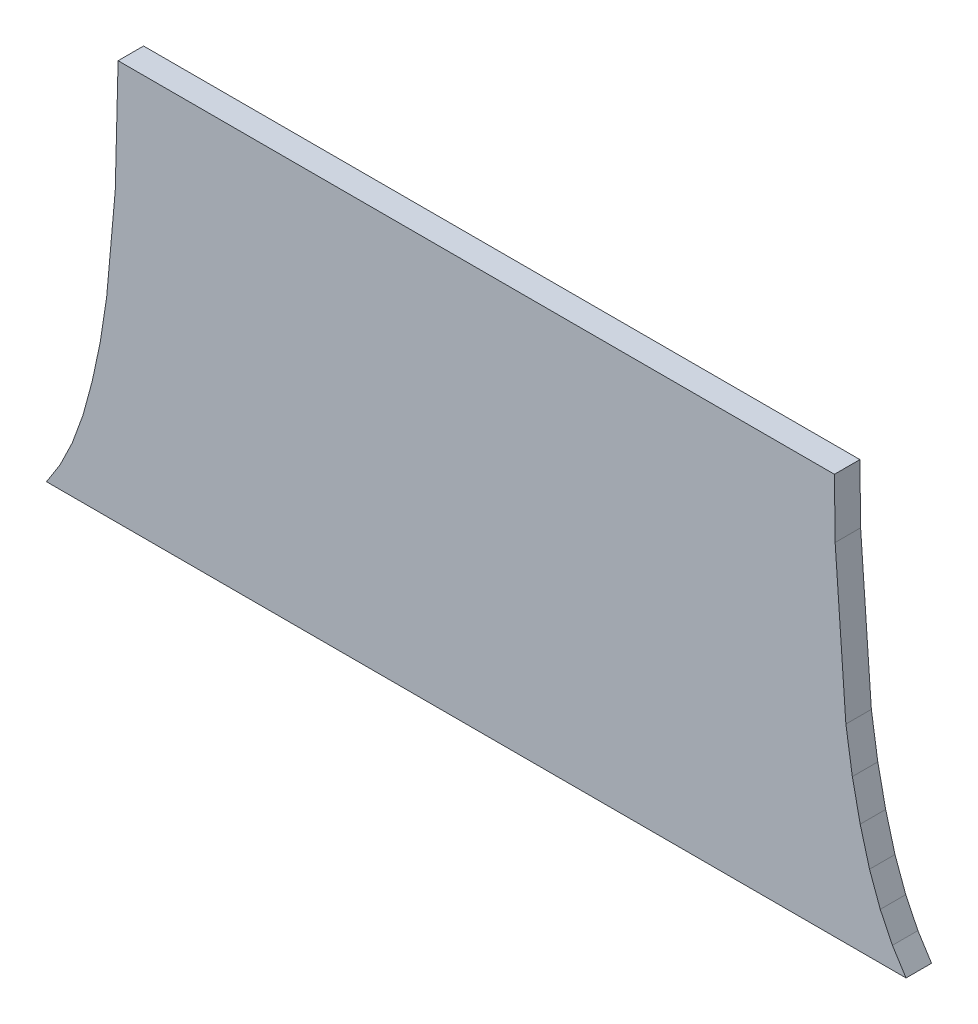
ISO-10303-21;
HEADER;
FILE_DESCRIPTION(('STEP AP214'),'2;1');
FILE_NAME('part.step','',(''),(''),'','','');
FILE_SCHEMA(('AUTOMOTIVE_DESIGN { 1 0 10303 214 1 1 1 1 }'));
ENDSEC;
DATA;
#1=APPLICATION_CONTEXT('core data for automotive mechanical design processes');
#2=APPLICATION_PROTOCOL_DEFINITION('international standard','automotive_design',2000,#1);
#3=PRODUCT_CONTEXT('',#1,'mechanical');
#4=PRODUCT('Part','Part','',(#3));
#5=PRODUCT_RELATED_PRODUCT_CATEGORY('part','',(#4));
#6=PRODUCT_DEFINITION_FORMATION('','',#4);
#7=PRODUCT_DEFINITION_CONTEXT('part definition',#1,'design');
#8=PRODUCT_DEFINITION('design','',#6,#7);
#9=PRODUCT_DEFINITION_SHAPE('','',#8);
#10=(LENGTH_UNIT() NAMED_UNIT(*) SI_UNIT(.MILLI.,.METRE.));
#11=(NAMED_UNIT(*) PLANE_ANGLE_UNIT() SI_UNIT($,.RADIAN.));
#12=(NAMED_UNIT(*) SI_UNIT($,.STERADIAN.) SOLID_ANGLE_UNIT());
#13=UNCERTAINTY_MEASURE_WITH_UNIT(LENGTH_MEASURE(1.E-05),#10,'distance_accuracy_value','');
#14=(GEOMETRIC_REPRESENTATION_CONTEXT(3) GLOBAL_UNCERTAINTY_ASSIGNED_CONTEXT((#13)) GLOBAL_UNIT_ASSIGNED_CONTEXT((#10,
#11,#12)) REPRESENTATION_CONTEXT('',''));
#15=CARTESIAN_POINT('',(0.,0.,0.));
#16=DIRECTION('',(0.,0.,1.));
#17=DIRECTION('',(1.,0.,0.));
#18=AXIS2_PLACEMENT_3D('',#15,#16,#17);
#19=CARTESIAN_POINT('',(88.4000015258789,42.0089988708496,0.));
#20=DIRECTION('',(0.,-1.,0.));
#21=DIRECTION('',(-1.,0.,0.));
#22=AXIS2_PLACEMENT_3D('',#19,#20,#21);
#23=PLANE('',#22);
#24=DIRECTION('',(-1.,0.,0.));
#25=VECTOR('',#24,1.);
#26=CARTESIAN_POINT('',(88.4000015258789,42.0089988708496,0.03556));
#27=LINE('',#26,#25);
#28=CARTESIAN_POINT('',(88.4000015258789,42.0089988708496,0.03556));
#29=VERTEX_POINT('',#28);
#30=CARTESIAN_POINT('',(87.4000015258789,42.0089988708496,0.03556));
#31=VERTEX_POINT('',#30);
#32=EDGE_CURVE('E11',#29,#31,#27,.T.);
#33=ORIENTED_EDGE('',*,*,#32,.F.);
#34=DIRECTION('',(0.,0.,1.));
#35=VECTOR('',#34,1.);
#36=CARTESIAN_POINT('',(88.4000015258789,42.0089988708496,0.));
#37=LINE('',#36,#35);
#38=CARTESIAN_POINT('',(88.4000015258789,42.0089988708496,0.));
#39=VERTEX_POINT('',#38);
#40=EDGE_CURVE('E24',#39,#29,#37,.T.);
#41=ORIENTED_EDGE('',*,*,#40,.F.);
#42=DIRECTION('',(-1.,0.,0.));
#43=VECTOR('',#42,1.);
#44=CARTESIAN_POINT('',(88.4000015258789,42.0089988708496,0.));
#45=LINE('',#44,#43);
#46=CARTESIAN_POINT('',(87.4000015258789,42.0089988708496,0.));
#47=VERTEX_POINT('',#46);
#48=EDGE_CURVE('E311',#39,#47,#45,.T.);
#49=ORIENTED_EDGE('',*,*,#48,.T.);
#50=DIRECTION('',(0.,0.,1.));
#51=VECTOR('',#50,1.);
#52=CARTESIAN_POINT('',(87.4000015258789,42.0089988708496,0.));
#53=LINE('',#52,#51);
#54=EDGE_CURVE('E37',#47,#31,#53,.T.);
#55=ORIENTED_EDGE('',*,*,#54,.T.);
#56=EDGE_LOOP('',(#33,#41,#49,#55));
#57=FACE_BOUND('',#56,.T.);
#58=ADVANCED_FACE('F17',(#57),#23,.F.);
#59=CARTESIAN_POINT('',(88.4010009765625,41.9269981384277,0.));
#60=DIRECTION('',(-0.999925730774336,-0.012187408888299,0.));
#61=DIRECTION('',(-0.012187408888299,0.999925730774336,0.));
#62=AXIS2_PLACEMENT_3D('',#59,#60,#61);
#63=PLANE('',#62);
#64=DIRECTION('',(-0.012187408888299,0.999925730774336,0.));
#65=VECTOR('',#64,1.);
#66=CARTESIAN_POINT('',(88.4010009765625,41.9269981384277,0.03556));
#67=LINE('',#66,#65);
#68=CARTESIAN_POINT('',(88.4010009765625,41.9269981384277,0.03556));
#69=VERTEX_POINT('',#68);
#70=EDGE_CURVE('E307',#69,#29,#67,.T.);
#71=ORIENTED_EDGE('',*,*,#70,.F.);
#72=DIRECTION('',(0.,0.,1.));
#73=VECTOR('',#72,1.);
#74=CARTESIAN_POINT('',(88.4010009765625,41.9269981384277,0.));
#75=LINE('',#74,#73);
#76=CARTESIAN_POINT('',(88.4010009765625,41.9269981384277,0.));
#77=VERTEX_POINT('',#76);
#78=EDGE_CURVE('E305',#77,#69,#75,.T.);
#79=ORIENTED_EDGE('',*,*,#78,.F.);
#80=DIRECTION('',(-0.012187408888299,0.999925730774336,0.));
#81=VECTOR('',#80,1.);
#82=CARTESIAN_POINT('',(88.4010009765625,41.9269981384277,0.));
#83=LINE('',#82,#81);
#84=EDGE_CURVE('E303',#77,#39,#83,.T.);
#85=ORIENTED_EDGE('',*,*,#84,.T.);
#86=ORIENTED_EDGE('',*,*,#40,.T.);
#87=EDGE_LOOP('',(#71,#79,#85,#86));
#88=FACE_BOUND('',#87,.T.);
#89=ADVANCED_FACE('F314',(#88),#63,.F.);
#90=CARTESIAN_POINT('',(88.416000366211,41.7150001525879,0.));
#91=DIRECTION('',(-0.997506399326628,-0.0705760816596304,0.));
#92=DIRECTION('',(-0.0705760816596304,0.997506399326628,0.));
#93=AXIS2_PLACEMENT_3D('',#90,#91,#92);
#94=PLANE('',#93);
#95=DIRECTION('',(-0.0705760816596304,0.997506399326628,0.));
#96=VECTOR('',#95,1.);
#97=CARTESIAN_POINT('',(88.4160003662109,41.7150001525879,0.03556));
#98=LINE('',#97,#96);
#99=CARTESIAN_POINT('',(88.4160003662109,41.7150001525879,0.03556));
#100=VERTEX_POINT('',#99);
#101=EDGE_CURVE('E300',#100,#69,#98,.T.);
#102=ORIENTED_EDGE('',*,*,#101,.F.);
#103=DIRECTION('',(0.,0.,1.));
#104=VECTOR('',#103,1.);
#105=CARTESIAN_POINT('',(88.4160003662109,41.7150001525879,0.));
#106=LINE('',#105,#104);
#107=CARTESIAN_POINT('',(88.4160003662109,41.7150001525879,0.));
#108=VERTEX_POINT('',#107);
#109=EDGE_CURVE('E298',#108,#100,#106,.T.);
#110=ORIENTED_EDGE('',*,*,#109,.F.);
#111=DIRECTION('',(-0.0705760816596304,0.997506399326628,0.));
#112=VECTOR('',#111,1.);
#113=CARTESIAN_POINT('',(88.4160003662109,41.7150001525879,0.));
#114=LINE('',#113,#112);
#115=EDGE_CURVE('E295',#108,#77,#114,.T.);
#116=ORIENTED_EDGE('',*,*,#115,.T.);
#117=ORIENTED_EDGE('',*,*,#78,.T.);
#118=EDGE_LOOP('',(#102,#110,#116,#117));
#119=FACE_BOUND('',#118,.T.);
#120=ADVANCED_FACE('F317',(#119),#94,.F.);
#121=CARTESIAN_POINT('',(88.4250030517578,41.6559982299805,0.));
#122=DIRECTION('',(-0.988558623060586,-0.150837159786835,0.));
#123=DIRECTION('',(-0.150837159786835,0.988558623060586,0.));
#124=AXIS2_PLACEMENT_3D('',#121,#122,#123);
#125=PLANE('',#124);
#126=DIRECTION('',(-0.150837159786835,0.988558623060586,0.));
#127=VECTOR('',#126,1.);
#128=CARTESIAN_POINT('',(88.4250030517578,41.6559982299805,0.03556));
#129=LINE('',#128,#127);
#130=CARTESIAN_POINT('',(88.4250030517578,41.6559982299805,0.03556));
#131=VERTEX_POINT('',#130);
#132=EDGE_CURVE('E292',#131,#100,#129,.T.);
#133=ORIENTED_EDGE('',*,*,#132,.F.);
#134=DIRECTION('',(0.,0.,1.));
#135=VECTOR('',#134,1.);
#136=CARTESIAN_POINT('',(88.4250030517578,41.6559982299805,0.));
#137=LINE('',#136,#135);
#138=CARTESIAN_POINT('',(88.4250030517578,41.6559982299805,0.));
#139=VERTEX_POINT('',#138);
#140=EDGE_CURVE('E290',#139,#131,#137,.T.);
#141=ORIENTED_EDGE('',*,*,#140,.F.);
#142=DIRECTION('',(-0.150837159786835,0.988558623060586,0.));
#143=VECTOR('',#142,1.);
#144=CARTESIAN_POINT('',(88.4250030517578,41.6559982299805,0.));
#145=LINE('',#144,#143);
#146=EDGE_CURVE('E287',#139,#108,#145,.T.);
#147=ORIENTED_EDGE('',*,*,#146,.T.);
#148=ORIENTED_EDGE('',*,*,#109,.T.);
#149=EDGE_LOOP('',(#133,#141,#147,#148));
#150=FACE_BOUND('',#149,.T.);
#151=ADVANCED_FACE('F322',(#150),#125,.F.);
#152=CARTESIAN_POINT('',(88.4359970092774,41.6040000915527,0.));
#153=DIRECTION('',(-0.978371217762549,-0.206856859334727,0.));
#154=DIRECTION('',(-0.206856859334727,0.978371217762549,0.));
#155=AXIS2_PLACEMENT_3D('',#152,#153,#154);
#156=PLANE('',#155);
#157=DIRECTION('',(-0.206856859334727,0.978371217762549,0.));
#158=VECTOR('',#157,1.);
#159=CARTESIAN_POINT('',(88.4359970092774,41.6040000915527,0.03556));
#160=LINE('',#159,#158);
#161=CARTESIAN_POINT('',(88.4359970092774,41.6040000915527,0.03556));
#162=VERTEX_POINT('',#161);
#163=EDGE_CURVE('E284',#162,#131,#160,.T.);
#164=ORIENTED_EDGE('',*,*,#163,.F.);
#165=DIRECTION('',(0.,0.,1.));
#166=VECTOR('',#165,1.);
#167=CARTESIAN_POINT('',(88.4359970092774,41.6040000915527,0.));
#168=LINE('',#167,#166);
#169=CARTESIAN_POINT('',(88.4359970092774,41.6040000915527,0.));
#170=VERTEX_POINT('',#169);
#171=EDGE_CURVE('E282',#170,#162,#168,.T.);
#172=ORIENTED_EDGE('',*,*,#171,.F.);
#173=DIRECTION('',(-0.206856859334727,0.978371217762549,0.));
#174=VECTOR('',#173,1.);
#175=CARTESIAN_POINT('',(88.4359970092774,41.6040000915527,0.));
#176=LINE('',#175,#174);
#177=EDGE_CURVE('E279',#170,#139,#176,.T.);
#178=ORIENTED_EDGE('',*,*,#177,.T.);
#179=ORIENTED_EDGE('',*,*,#140,.T.);
#180=EDGE_LOOP('',(#164,#172,#178,#179));
#181=FACE_BOUND('',#180,.T.);
#182=ADVANCED_FACE('F325',(#181),#156,.F.);
#183=CARTESIAN_POINT('',(88.4489974975586,41.5559997558594,0.));
#184=DIRECTION('',(-0.965224355692604,-0.26142292014626,0.));
#185=DIRECTION('',(-0.26142292014626,0.965224355692604,0.));
#186=AXIS2_PLACEMENT_3D('',#183,#184,#185);
#187=PLANE('',#186);
#188=DIRECTION('',(-0.26142292014626,0.965224355692604,0.));
#189=VECTOR('',#188,1.);
#190=CARTESIAN_POINT('',(88.4489974975586,41.5559997558594,0.03556));
#191=LINE('',#190,#189);
#192=CARTESIAN_POINT('',(88.4489974975586,41.5559997558594,0.03556));
#193=VERTEX_POINT('',#192);
#194=EDGE_CURVE('E276',#193,#162,#191,.T.);
#195=ORIENTED_EDGE('',*,*,#194,.F.);
#196=DIRECTION('',(0.,0.,1.));
#197=VECTOR('',#196,1.);
#198=CARTESIAN_POINT('',(88.4489974975586,41.5559997558594,0.));
#199=LINE('',#198,#197);
#200=CARTESIAN_POINT('',(88.4489974975586,41.5559997558594,0.));
#201=VERTEX_POINT('',#200);
#202=EDGE_CURVE('E274',#201,#193,#199,.T.);
#203=ORIENTED_EDGE('',*,*,#202,.F.);
#204=DIRECTION('',(-0.26142292014626,0.965224355692604,0.));
#205=VECTOR('',#204,1.);
#206=CARTESIAN_POINT('',(88.4489974975586,41.5559997558594,0.));
#207=LINE('',#206,#205);
#208=EDGE_CURVE('E271',#201,#170,#207,.T.);
#209=ORIENTED_EDGE('',*,*,#208,.T.);
#210=ORIENTED_EDGE('',*,*,#171,.T.);
#211=EDGE_LOOP('',(#195,#203,#209,#210));
#212=FACE_BOUND('',#211,.T.);
#213=ADVANCED_FACE('F330',(#212),#187,.F.);
#214=CARTESIAN_POINT('',(88.463996887207,41.5149993896484,0.));
#215=DIRECTION('',(-0.939128353177272,-0.343566494668128,0.));
#216=DIRECTION('',(-0.343566494668128,0.939128353177272,0.));
#217=AXIS2_PLACEMENT_3D('',#214,#215,#216);
#218=PLANE('',#217);
#219=DIRECTION('',(-0.343566494668128,0.939128353177272,0.));
#220=VECTOR('',#219,1.);
#221=CARTESIAN_POINT('',(88.463996887207,41.5149993896484,0.03556));
#222=LINE('',#221,#220);
#223=CARTESIAN_POINT('',(88.463996887207,41.5149993896484,0.03556));
#224=VERTEX_POINT('',#223);
#225=EDGE_CURVE('E268',#224,#193,#222,.T.);
#226=ORIENTED_EDGE('',*,*,#225,.F.);
#227=DIRECTION('',(0.,0.,1.));
#228=VECTOR('',#227,1.);
#229=CARTESIAN_POINT('',(88.463996887207,41.5149993896484,0.));
#230=LINE('',#229,#228);
#231=CARTESIAN_POINT('',(88.463996887207,41.5149993896484,0.));
#232=VERTEX_POINT('',#231);
#233=EDGE_CURVE('E266',#232,#224,#230,.T.);
#234=ORIENTED_EDGE('',*,*,#233,.F.);
#235=DIRECTION('',(-0.343566494668128,0.939128353177272,0.));
#236=VECTOR('',#235,1.);
#237=CARTESIAN_POINT('',(88.463996887207,41.5149993896484,0.));
#238=LINE('',#237,#236);
#239=EDGE_CURVE('E263',#232,#201,#238,.T.);
#240=ORIENTED_EDGE('',*,*,#239,.T.);
#241=ORIENTED_EDGE('',*,*,#202,.T.);
#242=EDGE_LOOP('',(#226,#234,#240,#241));
#243=FACE_BOUND('',#242,.T.);
#244=ADVANCED_FACE('F333',(#243),#218,.F.);
#245=CARTESIAN_POINT('',(88.4810028076172,41.4799995422363,0.));
#246=DIRECTION('',(-0.899447608111395,-0.437028603483444,0.));
#247=DIRECTION('',(-0.437028603483444,0.899447608111395,0.));
#248=AXIS2_PLACEMENT_3D('',#245,#246,#247);
#249=PLANE('',#248);
#250=DIRECTION('',(-0.437028603483444,0.899447608111395,0.));
#251=VECTOR('',#250,1.);
#252=CARTESIAN_POINT('',(88.4810028076172,41.4799995422363,0.03556));
#253=LINE('',#252,#251);
#254=CARTESIAN_POINT('',(88.4810028076172,41.4799995422363,0.03556));
#255=VERTEX_POINT('',#254);
#256=EDGE_CURVE('E260',#255,#224,#253,.T.);
#257=ORIENTED_EDGE('',*,*,#256,.F.);
#258=DIRECTION('',(0.,0.,1.));
#259=VECTOR('',#258,1.);
#260=CARTESIAN_POINT('',(88.4810028076172,41.4799995422363,0.));
#261=LINE('',#260,#259);
#262=CARTESIAN_POINT('',(88.4810028076172,41.4799995422363,0.));
#263=VERTEX_POINT('',#262);
#264=EDGE_CURVE('E258',#263,#255,#261,.T.);
#265=ORIENTED_EDGE('',*,*,#264,.F.);
#266=DIRECTION('',(-0.437028603483444,0.899447608111395,0.));
#267=VECTOR('',#266,1.);
#268=CARTESIAN_POINT('',(88.4810028076172,41.4799995422363,0.));
#269=LINE('',#268,#267);
#270=EDGE_CURVE('E255',#263,#232,#269,.T.);
#271=ORIENTED_EDGE('',*,*,#270,.T.);
#272=ORIENTED_EDGE('',*,*,#233,.T.);
#273=EDGE_LOOP('',(#257,#265,#271,#272));
#274=FACE_BOUND('',#273,.T.);
#275=ADVANCED_FACE('F338',(#274),#249,.F.);
#276=CARTESIAN_POINT('',(88.5,41.4500007629395,0.));
#277=DIRECTION('',(-0.844844974102474,-0.535011186550142,0.));
#278=DIRECTION('',(-0.535011186550142,0.844844974102474,0.));
#279=AXIS2_PLACEMENT_3D('',#276,#277,#278);
#280=PLANE('',#279);
#281=DIRECTION('',(-0.535011186550142,0.844844974102474,0.));
#282=VECTOR('',#281,1.);
#283=CARTESIAN_POINT('',(88.5,41.4500007629395,0.03556));
#284=LINE('',#283,#282);
#285=CARTESIAN_POINT('',(88.5,41.4500007629395,0.03556));
#286=VERTEX_POINT('',#285);
#287=EDGE_CURVE('E252',#286,#255,#284,.T.);
#288=ORIENTED_EDGE('',*,*,#287,.F.);
#289=DIRECTION('',(0.,0.,1.));
#290=VECTOR('',#289,1.);
#291=CARTESIAN_POINT('',(88.5,41.4500007629395,0.));
#292=LINE('',#291,#290);
#293=CARTESIAN_POINT('',(88.5,41.4500007629395,0.));
#294=VERTEX_POINT('',#293);
#295=EDGE_CURVE('E250',#294,#286,#292,.T.);
#296=ORIENTED_EDGE('',*,*,#295,.F.);
#297=DIRECTION('',(-0.535011186550142,0.844844974102474,0.));
#298=VECTOR('',#297,1.);
#299=CARTESIAN_POINT('',(88.5,41.4500007629395,0.));
#300=LINE('',#299,#298);
#301=EDGE_CURVE('E247',#294,#263,#300,.T.);
#302=ORIENTED_EDGE('',*,*,#301,.T.);
#303=ORIENTED_EDGE('',*,*,#264,.T.);
#304=EDGE_LOOP('',(#288,#296,#302,#303));
#305=FACE_BOUND('',#304,.T.);
#306=ADVANCED_FACE('F341',(#305),#280,.F.);
#307=CARTESIAN_POINT('',(87.9040198352961,41.4500007629395,0.));
#308=DIRECTION('',(0.,1.,0.));
#309=DIRECTION('',(1.,0.,0.));
#310=AXIS2_PLACEMENT_3D('',#307,#308,#309);
#311=PLANE('',#310);
#312=DIRECTION('',(1.,0.,0.));
#313=VECTOR('',#312,1.);
#314=CARTESIAN_POINT('',(87.3000030517578,41.4500007629395,0.03556));
#315=LINE('',#314,#313);
#316=CARTESIAN_POINT('',(87.9040198352961,41.4500007629395,0.03556));
#317=VERTEX_POINT('',#316);
#318=EDGE_CURVE('E244',#317,#286,#315,.T.);
#319=ORIENTED_EDGE('',*,*,#318,.F.);
#320=DIRECTION('',(0.,0.,1.));
#321=VECTOR('',#320,1.);
#322=CARTESIAN_POINT('',(87.9040198352961,41.4500007629395,0.));
#323=LINE('',#322,#321);
#324=CARTESIAN_POINT('',(87.9040198352961,41.4500007629395,0.));
#325=VERTEX_POINT('',#324);
#326=EDGE_CURVE('E242',#325,#317,#323,.T.);
#327=ORIENTED_EDGE('',*,*,#326,.F.);
#328=DIRECTION('',(1.,0.,0.));
#329=VECTOR('',#328,1.);
#330=CARTESIAN_POINT('',(87.3000030517578,41.4500007629395,0.));
#331=LINE('',#330,#329);
#332=EDGE_CURVE('E239',#325,#294,#331,.T.);
#333=ORIENTED_EDGE('',*,*,#332,.T.);
#334=ORIENTED_EDGE('',*,*,#295,.T.);
#335=EDGE_LOOP('',(#319,#327,#333,#334));
#336=FACE_BOUND('',#335,.T.);
#337=ADVANCED_FACE('F346',(#336),#311,.F.);
#338=CARTESIAN_POINT('',(87.900002,41.0000196,0.));
#339=DIRECTION('',(0.,0.,-1.));
#340=DIRECTION('',(1.,0.,0.));
#341=AXIS2_PLACEMENT_3D('',#338,#339,#340);
#342=CYLINDRICAL_SURFACE('',#341,0.4499991);
#343=ORIENTED_EDGE('',*,*,#326,.T.);
#344=CARTESIAN_POINT('',(87.900002,41.0000196,0.03556));
#345=DIRECTION('',(0.,0.,1.));
#346=DIRECTION('',(1.,0.,0.));
#347=AXIS2_PLACEMENT_3D('',#344,#345,#346);
#348=CIRCLE('',#347,0.4499991);
#349=CARTESIAN_POINT('',(87.8959841647038,41.4500007629395,0.03556));
#350=VERTEX_POINT('',#349);
#351=EDGE_CURVE('E236',#317,#350,#348,.T.);
#352=ORIENTED_EDGE('',*,*,#351,.T.);
#353=DIRECTION('',(0.,0.,1.));
#354=VECTOR('',#353,1.);
#355=CARTESIAN_POINT('',(87.8959841647038,41.4500007629395,0.));
#356=LINE('',#355,#354);
#357=CARTESIAN_POINT('',(87.8959841647038,41.4500007629395,0.));
#358=VERTEX_POINT('',#357);
#359=EDGE_CURVE('E234',#358,#350,#356,.T.);
#360=ORIENTED_EDGE('',*,*,#359,.F.);
#361=CARTESIAN_POINT('',(87.900002,41.0000196,0.));
#362=DIRECTION('',(0.,0.,1.));
#363=DIRECTION('',(1.,0.,0.));
#364=AXIS2_PLACEMENT_3D('',#361,#362,#363);
#365=CIRCLE('',#364,0.4499991);
#366=EDGE_CURVE('E231',#325,#358,#365,.T.);
#367=ORIENTED_EDGE('',*,*,#366,.F.);
#368=EDGE_LOOP('',(#343,#352,#360,#367));
#369=FACE_BOUND('',#368,.T.);
#370=ADVANCED_FACE('F349',(#369),#342,.F.);
#371=CARTESIAN_POINT('',(87.3000030517578,41.4500007629395,0.));
#372=DIRECTION('',(0.,1.,0.));
#373=DIRECTION('',(1.,0.,0.));
#374=AXIS2_PLACEMENT_3D('',#371,#372,#373);
#375=PLANE('',#374);
#376=DIRECTION('',(1.,0.,0.));
#377=VECTOR('',#376,1.);
#378=CARTESIAN_POINT('',(87.3000030517578,41.4500007629395,0.03556));
#379=LINE('',#378,#377);
#380=CARTESIAN_POINT('',(87.3000030517578,41.4500007629395,0.03556));
#381=VERTEX_POINT('',#380);
#382=EDGE_CURVE('E228',#381,#350,#379,.T.);
#383=ORIENTED_EDGE('',*,*,#382,.F.);
#384=DIRECTION('',(0.,0.,1.));
#385=VECTOR('',#384,1.);
#386=CARTESIAN_POINT('',(87.3000030517578,41.4500007629395,0.));
#387=LINE('',#386,#385);
#388=CARTESIAN_POINT('',(87.3000030517578,41.4500007629395,0.));
#389=VERTEX_POINT('',#388);
#390=EDGE_CURVE('E226',#389,#381,#387,.T.);
#391=ORIENTED_EDGE('',*,*,#390,.F.);
#392=EDGE_CURVE('E225',#389,#358,#331,.T.);
#393=ORIENTED_EDGE('',*,*,#392,.T.);
#394=ORIENTED_EDGE('',*,*,#359,.T.);
#395=EDGE_LOOP('',(#383,#391,#393,#394));
#396=FACE_BOUND('',#395,.T.);
#397=ADVANCED_FACE('F355',(#396),#375,.F.);
#398=CARTESIAN_POINT('',(87.3190002441406,41.4799995422363,0.));
#399=DIRECTION('',(0.844844974102474,-0.535011186550142,0.));
#400=DIRECTION('',(-0.535011186550142,-0.844844974102474,0.));
#401=AXIS2_PLACEMENT_3D('',#398,#399,#400);
#402=PLANE('',#401);
#403=DIRECTION('',(-0.535011186550142,-0.844844974102474,0.));
#404=VECTOR('',#403,1.);
#405=CARTESIAN_POINT('',(87.3190002441406,41.4799995422363,0.03556));
#406=LINE('',#405,#404);
#407=CARTESIAN_POINT('',(87.3190002441406,41.4799995422363,0.03556));
#408=VERTEX_POINT('',#407);
#409=EDGE_CURVE('E222',#408,#381,#406,.T.);
#410=ORIENTED_EDGE('',*,*,#409,.F.);
#411=DIRECTION('',(0.,0.,1.));
#412=VECTOR('',#411,1.);
#413=CARTESIAN_POINT('',(87.3190002441406,41.4799995422363,0.));
#414=LINE('',#413,#412);
#415=CARTESIAN_POINT('',(87.3190002441406,41.4799995422363,0.));
#416=VERTEX_POINT('',#415);
#417=EDGE_CURVE('E220',#416,#408,#414,.T.);
#418=ORIENTED_EDGE('',*,*,#417,.F.);
#419=DIRECTION('',(-0.535011186550142,-0.844844974102474,0.));
#420=VECTOR('',#419,1.);
#421=CARTESIAN_POINT('',(87.3190002441406,41.4799995422363,0.));
#422=LINE('',#421,#420);
#423=EDGE_CURVE('E217',#416,#389,#422,.T.);
#424=ORIENTED_EDGE('',*,*,#423,.T.);
#425=ORIENTED_EDGE('',*,*,#390,.T.);
#426=EDGE_LOOP('',(#410,#418,#424,#425));
#427=FACE_BOUND('',#426,.T.);
#428=ADVANCED_FACE('F358',(#427),#402,.F.);
#429=CARTESIAN_POINT('',(87.3359985351562,41.5149993896484,0.));
#430=DIRECTION('',(0.89952467075599,-0.43686996543746,0.));
#431=DIRECTION('',(-0.43686996543746,-0.89952467075599,0.));
#432=AXIS2_PLACEMENT_3D('',#429,#430,#431);
#433=PLANE('',#432);
#434=DIRECTION('',(-0.43686996543746,-0.89952467075599,0.));
#435=VECTOR('',#434,1.);
#436=CARTESIAN_POINT('',(87.3359985351562,41.5149993896484,0.03556));
#437=LINE('',#436,#435);
#438=CARTESIAN_POINT('',(87.3359985351562,41.5149993896484,0.03556));
#439=VERTEX_POINT('',#438);
#440=EDGE_CURVE('E214',#439,#408,#437,.T.);
#441=ORIENTED_EDGE('',*,*,#440,.F.);
#442=DIRECTION('',(0.,0.,1.));
#443=VECTOR('',#442,1.);
#444=CARTESIAN_POINT('',(87.3359985351562,41.5149993896484,0.));
#445=LINE('',#444,#443);
#446=CARTESIAN_POINT('',(87.3359985351562,41.5149993896484,0.));
#447=VERTEX_POINT('',#446);
#448=EDGE_CURVE('E212',#447,#439,#445,.T.);
#449=ORIENTED_EDGE('',*,*,#448,.F.);
#450=DIRECTION('',(-0.43686996543746,-0.89952467075599,0.));
#451=VECTOR('',#450,1.);
#452=CARTESIAN_POINT('',(87.3359985351562,41.5149993896484,0.));
#453=LINE('',#452,#451);
#454=EDGE_CURVE('E209',#447,#416,#453,.T.);
#455=ORIENTED_EDGE('',*,*,#454,.T.);
#456=ORIENTED_EDGE('',*,*,#417,.T.);
#457=EDGE_LOOP('',(#441,#449,#455,#456));
#458=FACE_BOUND('',#457,.T.);
#459=ADVANCED_FACE('F363',(#458),#433,.F.);
#460=CARTESIAN_POINT('',(87.3509979248047,41.5559997558594,0.));
#461=DIRECTION('',(0.939128353177272,-0.343566494668128,0.));
#462=DIRECTION('',(-0.343566494668128,-0.939128353177272,0.));
#463=AXIS2_PLACEMENT_3D('',#460,#461,#462);
#464=PLANE('',#463);
#465=DIRECTION('',(-0.343566494668128,-0.939128353177272,0.));
#466=VECTOR('',#465,1.);
#467=CARTESIAN_POINT('',(87.3509979248047,41.5559997558594,0.03556));
#468=LINE('',#467,#466);
#469=CARTESIAN_POINT('',(87.3509979248047,41.5559997558594,0.03556));
#470=VERTEX_POINT('',#469);
#471=EDGE_CURVE('E206',#470,#439,#468,.T.);
#472=ORIENTED_EDGE('',*,*,#471,.F.);
#473=DIRECTION('',(0.,0.,1.));
#474=VECTOR('',#473,1.);
#475=CARTESIAN_POINT('',(87.3509979248047,41.5559997558594,0.));
#476=LINE('',#475,#474);
#477=CARTESIAN_POINT('',(87.3509979248047,41.5559997558594,0.));
#478=VERTEX_POINT('',#477);
#479=EDGE_CURVE('E204',#478,#470,#476,.T.);
#480=ORIENTED_EDGE('',*,*,#479,.F.);
#481=DIRECTION('',(-0.343566494668128,-0.939128353177272,0.));
#482=VECTOR('',#481,1.);
#483=CARTESIAN_POINT('',(87.3509979248047,41.5559997558594,0.));
#484=LINE('',#483,#482);
#485=EDGE_CURVE('E201',#478,#447,#484,.T.);
#486=ORIENTED_EDGE('',*,*,#485,.T.);
#487=ORIENTED_EDGE('',*,*,#448,.T.);
#488=EDGE_LOOP('',(#472,#480,#486,#487));
#489=FACE_BOUND('',#488,.T.);
#490=ADVANCED_FACE('F366',(#489),#464,.F.);
#491=CARTESIAN_POINT('',(87.3639984130859,41.6040000915527,0.));
#492=DIRECTION('',(0.965224355692604,-0.26142292014626,0.));
#493=DIRECTION('',(-0.26142292014626,-0.965224355692604,0.));
#494=AXIS2_PLACEMENT_3D('',#491,#492,#493);
#495=PLANE('',#494);
#496=DIRECTION('',(-0.26142292014626,-0.965224355692604,0.));
#497=VECTOR('',#496,1.);
#498=CARTESIAN_POINT('',(87.3639984130859,41.6040000915527,0.03556));
#499=LINE('',#498,#497);
#500=CARTESIAN_POINT('',(87.3639984130859,41.6040000915527,0.03556));
#501=VERTEX_POINT('',#500);
#502=EDGE_CURVE('E198',#501,#470,#499,.T.);
#503=ORIENTED_EDGE('',*,*,#502,.F.);
#504=DIRECTION('',(0.,0.,1.));
#505=VECTOR('',#504,1.);
#506=CARTESIAN_POINT('',(87.3639984130859,41.6040000915527,0.));
#507=LINE('',#506,#505);
#508=CARTESIAN_POINT('',(87.3639984130859,41.6040000915527,0.));
#509=VERTEX_POINT('',#508);
#510=EDGE_CURVE('E196',#509,#501,#507,.T.);
#511=ORIENTED_EDGE('',*,*,#510,.F.);
#512=DIRECTION('',(-0.26142292014626,-0.965224355692604,0.));
#513=VECTOR('',#512,1.);
#514=CARTESIAN_POINT('',(87.3639984130859,41.6040000915527,0.));
#515=LINE('',#514,#513);
#516=EDGE_CURVE('E193',#509,#478,#515,.T.);
#517=ORIENTED_EDGE('',*,*,#516,.T.);
#518=ORIENTED_EDGE('',*,*,#479,.T.);
#519=EDGE_LOOP('',(#503,#511,#517,#518));
#520=FACE_BOUND('',#519,.T.);
#521=ADVANCED_FACE('F370',(#520),#495,.F.);
#522=CARTESIAN_POINT('',(87.375,41.6559982299805,0.));
#523=DIRECTION('',(0.978342156742386,-0.206994261612871,0.));
#524=DIRECTION('',(-0.206994261612871,-0.978342156742386,0.));
#525=AXIS2_PLACEMENT_3D('',#522,#523,#524);
#526=PLANE('',#525);
#527=DIRECTION('',(-0.206994261612871,-0.978342156742385,0.));
#528=VECTOR('',#527,1.);
#529=CARTESIAN_POINT('',(87.375,41.6559982299805,0.03556));
#530=LINE('',#529,#528);
#531=CARTESIAN_POINT('',(87.375,41.6559982299805,0.03556));
#532=VERTEX_POINT('',#531);
#533=EDGE_CURVE('E190',#532,#501,#530,.T.);
#534=ORIENTED_EDGE('',*,*,#533,.F.);
#535=DIRECTION('',(0.,0.,1.));
#536=VECTOR('',#535,1.);
#537=CARTESIAN_POINT('',(87.375,41.6559982299805,0.));
#538=LINE('',#537,#536);
#539=CARTESIAN_POINT('',(87.375,41.6559982299805,0.));
#540=VERTEX_POINT('',#539);
#541=EDGE_CURVE('E188',#540,#532,#538,.T.);
#542=ORIENTED_EDGE('',*,*,#541,.F.);
#543=DIRECTION('',(-0.206994261612871,-0.978342156742385,0.));
#544=VECTOR('',#543,1.);
#545=CARTESIAN_POINT('',(87.375,41.6559982299805,0.));
#546=LINE('',#545,#544);
#547=EDGE_CURVE('E185',#540,#509,#546,.T.);
#548=ORIENTED_EDGE('',*,*,#547,.T.);
#549=ORIENTED_EDGE('',*,*,#510,.T.);
#550=EDGE_LOOP('',(#534,#542,#548,#549));
#551=FACE_BOUND('',#550,.T.);
#552=ADVANCED_FACE('F373',(#551),#526,.F.);
#553=CARTESIAN_POINT('',(87.3840026855469,41.7150001525879,0.));
#554=DIRECTION('',(0.988558623060586,-0.150837159786835,0.));
#555=DIRECTION('',(-0.150837159786835,-0.988558623060586,0.));
#556=AXIS2_PLACEMENT_3D('',#553,#554,#555);
#557=PLANE('',#556);
#558=DIRECTION('',(-0.150837159786835,-0.988558623060586,0.));
#559=VECTOR('',#558,1.);
#560=CARTESIAN_POINT('',(87.3840026855469,41.7150001525879,0.03556));
#561=LINE('',#560,#559);
#562=CARTESIAN_POINT('',(87.3840026855469,41.7150001525879,0.03556));
#563=VERTEX_POINT('',#562);
#564=EDGE_CURVE('E182',#563,#532,#561,.T.);
#565=ORIENTED_EDGE('',*,*,#564,.F.);
#566=DIRECTION('',(0.,0.,1.));
#567=VECTOR('',#566,1.);
#568=CARTESIAN_POINT('',(87.3840026855469,41.7150001525879,0.));
#569=LINE('',#568,#567);
#570=CARTESIAN_POINT('',(87.3840026855469,41.7150001525879,0.));
#571=VERTEX_POINT('',#570);
#572=EDGE_CURVE('E180',#571,#563,#569,.T.);
#573=ORIENTED_EDGE('',*,*,#572,.F.);
#574=DIRECTION('',(-0.150837159786835,-0.988558623060586,0.));
#575=VECTOR('',#574,1.);
#576=CARTESIAN_POINT('',(87.3840026855469,41.7150001525879,0.));
#577=LINE('',#576,#575);
#578=EDGE_CURVE('E171',#571,#540,#577,.T.);
#579=ORIENTED_EDGE('',*,*,#578,.T.);
#580=ORIENTED_EDGE('',*,*,#541,.T.);
#581=EDGE_LOOP('',(#565,#573,#579,#580));
#582=FACE_BOUND('',#581,.T.);
#583=ADVANCED_FACE('F376',(#582),#557,.F.);
#584=CARTESIAN_POINT('',(87.3960037231445,41.8499984741211,0.));
#585=DIRECTION('',(0.996071868387923,-0.0885484782827547,0.));
#586=DIRECTION('',(-0.0885484782827547,-0.996071868387923,0.));
#587=AXIS2_PLACEMENT_3D('',#584,#585,#586);
#588=PLANE('',#587);
#589=DIRECTION('',(-0.0885484782827547,-0.996071868387923,0.));
#590=VECTOR('',#589,1.);
#591=CARTESIAN_POINT('',(87.3960037231445,41.8499984741211,0.03556));
#592=LINE('',#591,#590);
#593=CARTESIAN_POINT('',(87.3960037231445,41.8499984741211,0.03556));
#594=VERTEX_POINT('',#593);
#595=EDGE_CURVE('E157',#594,#563,#592,.T.);
#596=ORIENTED_EDGE('',*,*,#595,.F.);
#597=DIRECTION('',(0.,0.,1.));
#598=VECTOR('',#597,1.);
#599=CARTESIAN_POINT('',(87.3960037231445,41.8499984741211,0.));
#600=LINE('',#599,#598);
#601=CARTESIAN_POINT('',(87.3960037231445,41.8499984741211,0.));
#602=VERTEX_POINT('',#601);
#603=EDGE_CURVE('E152',#602,#594,#600,.T.);
#604=ORIENTED_EDGE('',*,*,#603,.F.);
#605=DIRECTION('',(-0.0885484782827547,-0.996071868387923,0.));
#606=VECTOR('',#605,1.);
#607=CARTESIAN_POINT('',(87.3960037231445,41.8499984741211,0.));
#608=LINE('',#607,#606);
#609=EDGE_CURVE('E155',#602,#571,#608,.T.);
#610=ORIENTED_EDGE('',*,*,#609,.T.);
#611=ORIENTED_EDGE('',*,*,#572,.T.);
#612=EDGE_LOOP('',(#596,#604,#610,#611));
#613=FACE_BOUND('',#612,.T.);
#614=ADVANCED_FACE('F154',(#613),#588,.F.);
#615=CARTESIAN_POINT('',(87.4000015258789,42.0089988708496,0.));
#616=DIRECTION('',(0.999684055752358,-0.0251354067903474,0.));
#617=DIRECTION('',(-0.0251354067903474,-0.999684055752358,0.));
#618=AXIS2_PLACEMENT_3D('',#615,#616,#617);
#619=PLANE('',#618);
#620=DIRECTION('',(-0.0251354067903474,-0.999684055752358,0.));
#621=VECTOR('',#620,1.);
#622=CARTESIAN_POINT('',(87.4000015258789,42.0089988708496,0.03556));
#623=LINE('',#622,#621);
#624=EDGE_CURVE('E172',#31,#594,#623,.T.);
#625=ORIENTED_EDGE('',*,*,#624,.F.);
#626=ORIENTED_EDGE('',*,*,#54,.F.);
#627=DIRECTION('',(-0.0251354067903474,-0.999684055752358,0.));
#628=VECTOR('',#627,1.);
#629=CARTESIAN_POINT('',(87.4000015258789,42.0089988708496,0.));
#630=LINE('',#629,#628);
#631=EDGE_CURVE('E168',#47,#602,#630,.T.);
#632=ORIENTED_EDGE('',*,*,#631,.T.);
#633=ORIENTED_EDGE('',*,*,#603,.T.);
#634=EDGE_LOOP('',(#625,#626,#632,#633));
#635=FACE_BOUND('',#634,.T.);
#636=ADVANCED_FACE('F174',(#635),#619,.F.);
#637=CARTESIAN_POINT('',(87.4000015258789,42.0089988708496,0.));
#638=DIRECTION('',(0.,0.,1.));
#639=DIRECTION('',(1.,0.,0.));
#640=AXIS2_PLACEMENT_3D('',#637,#638,#639);
#641=PLANE('',#640);
#642=ORIENTED_EDGE('',*,*,#631,.F.);
#643=ORIENTED_EDGE('',*,*,#48,.F.);
#644=ORIENTED_EDGE('',*,*,#84,.F.);
#645=ORIENTED_EDGE('',*,*,#115,.F.);
#646=ORIENTED_EDGE('',*,*,#146,.F.);
#647=ORIENTED_EDGE('',*,*,#177,.F.);
#648=ORIENTED_EDGE('',*,*,#208,.F.);
#649=ORIENTED_EDGE('',*,*,#239,.F.);
#650=ORIENTED_EDGE('',*,*,#270,.F.);
#651=ORIENTED_EDGE('',*,*,#301,.F.);
#652=ORIENTED_EDGE('',*,*,#332,.F.);
#653=ORIENTED_EDGE('',*,*,#366,.T.);
#654=ORIENTED_EDGE('',*,*,#392,.F.);
#655=ORIENTED_EDGE('',*,*,#423,.F.);
#656=ORIENTED_EDGE('',*,*,#454,.F.);
#657=ORIENTED_EDGE('',*,*,#485,.F.);
#658=ORIENTED_EDGE('',*,*,#516,.F.);
#659=ORIENTED_EDGE('',*,*,#547,.F.);
#660=ORIENTED_EDGE('',*,*,#578,.F.);
#661=ORIENTED_EDGE('',*,*,#609,.F.);
#662=EDGE_LOOP('',(#642,#643,#644,#645,#646,#647,#648,#649,#650,#651,#652,#653,#654,#655,#656,
#657,#658,#659,#660,#661));
#663=FACE_BOUND('',#662,.T.);
#664=ADVANCED_FACE('F166',(#663),#641,.F.);
#665=CARTESIAN_POINT('',(87.4000015258789,42.0089988708496,0.03556));
#666=DIRECTION('',(0.,0.,1.));
#667=DIRECTION('',(1.,0.,0.));
#668=AXIS2_PLACEMENT_3D('',#665,#666,#667);
#669=PLANE('',#668);
#670=ORIENTED_EDGE('',*,*,#32,.T.);
#671=ORIENTED_EDGE('',*,*,#624,.T.);
#672=ORIENTED_EDGE('',*,*,#595,.T.);
#673=ORIENTED_EDGE('',*,*,#564,.T.);
#674=ORIENTED_EDGE('',*,*,#533,.T.);
#675=ORIENTED_EDGE('',*,*,#502,.T.);
#676=ORIENTED_EDGE('',*,*,#471,.T.);
#677=ORIENTED_EDGE('',*,*,#440,.T.);
#678=ORIENTED_EDGE('',*,*,#409,.T.);
#679=ORIENTED_EDGE('',*,*,#382,.T.);
#680=ORIENTED_EDGE('',*,*,#351,.F.);
#681=ORIENTED_EDGE('',*,*,#318,.T.);
#682=ORIENTED_EDGE('',*,*,#287,.T.);
#683=ORIENTED_EDGE('',*,*,#256,.T.);
#684=ORIENTED_EDGE('',*,*,#225,.T.);
#685=ORIENTED_EDGE('',*,*,#194,.T.);
#686=ORIENTED_EDGE('',*,*,#163,.T.);
#687=ORIENTED_EDGE('',*,*,#132,.T.);
#688=ORIENTED_EDGE('',*,*,#101,.T.);
#689=ORIENTED_EDGE('',*,*,#70,.T.);
#690=EDGE_LOOP('',(#670,#671,#672,#673,#674,#675,#676,#677,#678,#679,#680,#681,#682,#683,#684,
#685,#686,#687,#688,#689));
#691=FACE_BOUND('',#690,.T.);
#692=ADVANCED_FACE('F378',(#691),#669,.T.);
#693=CLOSED_SHELL('',(#58,#89,#120,#151,#182,#213,#244,#275,#306,#337,#370,#397,#428,#459,#490,
#521,#552,#583,#614,#636,#664,#692));
#694=MANIFOLD_SOLID_BREP('B1',#693);
#695=ADVANCED_BREP_SHAPE_REPRESENTATION('',(#18,#694),#14);
#696=SHAPE_DEFINITION_REPRESENTATION(#9,#695);
ENDSEC;
END-ISO-10303-21;
